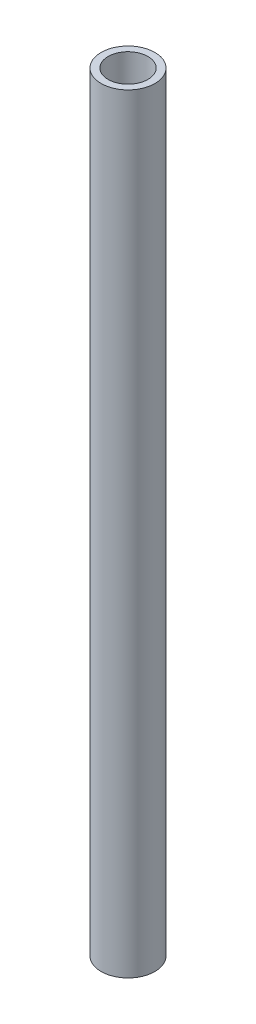
ISO-10303-21;
HEADER;
FILE_DESCRIPTION(('STEP AP214'),'2;1');
FILE_NAME('part.step','',(''),(''),'','','');
FILE_SCHEMA(('AUTOMOTIVE_DESIGN { 1 0 10303 214 1 1 1 1 }'));
ENDSEC;
DATA;
#1=APPLICATION_CONTEXT('core data for automotive mechanical design processes');
#2=APPLICATION_PROTOCOL_DEFINITION('international standard','automotive_design',2000,#1);
#3=PRODUCT_CONTEXT('',#1,'mechanical');
#4=PRODUCT('Part','Part','',(#3));
#5=PRODUCT_RELATED_PRODUCT_CATEGORY('part','',(#4));
#6=PRODUCT_DEFINITION_FORMATION('','',#4);
#7=PRODUCT_DEFINITION_CONTEXT('part definition',#1,'design');
#8=PRODUCT_DEFINITION('design','',#6,#7);
#9=PRODUCT_DEFINITION_SHAPE('','',#8);
#10=(LENGTH_UNIT() NAMED_UNIT(*) SI_UNIT(.MILLI.,.METRE.));
#11=(NAMED_UNIT(*) PLANE_ANGLE_UNIT() SI_UNIT($,.RADIAN.));
#12=(NAMED_UNIT(*) SI_UNIT($,.STERADIAN.) SOLID_ANGLE_UNIT());
#13=UNCERTAINTY_MEASURE_WITH_UNIT(LENGTH_MEASURE(1.E-05),#10,'distance_accuracy_value','');
#14=(GEOMETRIC_REPRESENTATION_CONTEXT(3) GLOBAL_UNCERTAINTY_ASSIGNED_CONTEXT((#13)) GLOBAL_UNIT_ASSIGNED_CONTEXT((#10,
#11,#12)) REPRESENTATION_CONTEXT('',''));
#15=CARTESIAN_POINT('',(0.,0.,0.));
#16=DIRECTION('',(0.,0.,1.));
#17=DIRECTION('',(1.,0.,0.));
#18=AXIS2_PLACEMENT_3D('',#15,#16,#17);
#19=CARTESIAN_POINT('',(0.,304.8,0.));
#20=DIRECTION('',(0.,1.,0.));
#21=DIRECTION('',(0.,0.,1.));
#22=AXIS2_PLACEMENT_3D('',#19,#20,#21);
#23=PLANE('',#22);
#24=CARTESIAN_POINT('',(0.,304.8,0.));
#25=DIRECTION('',(0.,1.,0.));
#26=DIRECTION('',(0.,0.,1.));
#27=AXIS2_PLACEMENT_3D('',#24,#25,#26);
#28=CIRCLE('',#27,10.668);
#29=CARTESIAN_POINT('',(0.,304.8,-10.668));
#30=VERTEX_POINT('',#29);
#31=EDGE_CURVE('E10',#30,#30,#28,.T.);
#32=ORIENTED_EDGE('',*,*,#31,.T.);
#33=EDGE_LOOP('',(#32));
#34=FACE_BOUND('',#33,.T.);
#35=CARTESIAN_POINT('',(0.,304.8,0.));
#36=DIRECTION('',(0.,1.,0.));
#37=DIRECTION('',(0.,0.,1.));
#38=AXIS2_PLACEMENT_3D('',#35,#36,#37);
#39=CIRCLE('',#38,7.8994);
#40=CARTESIAN_POINT('',(0.,304.8,-7.8994));
#41=VERTEX_POINT('',#40);
#42=EDGE_CURVE('E50',#41,#41,#39,.T.);
#43=ORIENTED_EDGE('',*,*,#42,.F.);
#44=EDGE_LOOP('',(#43));
#45=FACE_BOUND('',#44,.T.);
#46=ADVANCED_FACE('F37',(#34,#45),#23,.T.);
#47=CARTESIAN_POINT('',(0.,0.,0.));
#48=DIRECTION('',(0.,1.,0.));
#49=DIRECTION('',(0.,0.,1.));
#50=AXIS2_PLACEMENT_3D('',#47,#48,#49);
#51=PLANE('',#50);
#52=CARTESIAN_POINT('',(0.,0.,0.));
#53=DIRECTION('',(0.,1.,0.));
#54=DIRECTION('',(0.,0.,1.));
#55=AXIS2_PLACEMENT_3D('',#52,#53,#54);
#56=CIRCLE('',#55,10.668);
#57=CARTESIAN_POINT('',(0.,0.,-10.668));
#58=VERTEX_POINT('',#57);
#59=EDGE_CURVE('E41',#58,#58,#56,.T.);
#60=ORIENTED_EDGE('',*,*,#59,.F.);
#61=EDGE_LOOP('',(#60));
#62=FACE_BOUND('',#61,.T.);
#63=CARTESIAN_POINT('',(0.,0.,0.));
#64=DIRECTION('',(0.,1.,0.));
#65=DIRECTION('',(0.,0.,1.));
#66=AXIS2_PLACEMENT_3D('',#63,#64,#65);
#67=CIRCLE('',#66,7.8994);
#68=CARTESIAN_POINT('',(0.,0.,-7.8994));
#69=VERTEX_POINT('',#68);
#70=EDGE_CURVE('E52',#69,#69,#67,.T.);
#71=ORIENTED_EDGE('',*,*,#70,.T.);
#72=EDGE_LOOP('',(#71));
#73=FACE_BOUND('',#72,.T.);
#74=ADVANCED_FACE('F64',(#62,#73),#51,.F.);
#75=CARTESIAN_POINT('',(0.,304.8,0.));
#76=DIRECTION('',(0.,-1.,0.));
#77=DIRECTION('',(0.,0.,-1.));
#78=AXIS2_PLACEMENT_3D('',#75,#76,#77);
#79=CYLINDRICAL_SURFACE('',#78,10.668);
#80=CARTESIAN_POINT('',(0.,304.8,-10.668));
#81=CARTESIAN_POINT('',(0.,301.625,-10.668));
#82=CARTESIAN_POINT('',(0.,298.45,-10.668));
#83=CARTESIAN_POINT('',(0.,292.1,-10.668));
#84=CARTESIAN_POINT('',(0.,288.925,-10.668));
#85=CARTESIAN_POINT('',(0.,282.575,-10.668));
#86=CARTESIAN_POINT('',(0.,279.4,-10.668));
#87=CARTESIAN_POINT('',(0.,273.05,-10.668));
#88=CARTESIAN_POINT('',(0.,269.875,-10.668));
#89=CARTESIAN_POINT('',(0.,263.525,-10.668));
#90=CARTESIAN_POINT('',(0.,260.35,-10.668));
#91=CARTESIAN_POINT('',(0.,254.,-10.668));
#92=CARTESIAN_POINT('',(0.,250.825,-10.668));
#93=CARTESIAN_POINT('',(0.,244.475,-10.668));
#94=CARTESIAN_POINT('',(0.,241.3,-10.668));
#95=CARTESIAN_POINT('',(0.,234.95,-10.668));
#96=CARTESIAN_POINT('',(0.,231.775,-10.668));
#97=CARTESIAN_POINT('',(0.,225.425,-10.668));
#98=CARTESIAN_POINT('',(0.,222.25,-10.668));
#99=CARTESIAN_POINT('',(0.,215.9,-10.668));
#100=CARTESIAN_POINT('',(0.,212.725,-10.668));
#101=CARTESIAN_POINT('',(0.,206.375,-10.668));
#102=CARTESIAN_POINT('',(0.,203.2,-10.668));
#103=CARTESIAN_POINT('',(0.,196.85,-10.668));
#104=CARTESIAN_POINT('',(0.,193.675,-10.668));
#105=CARTESIAN_POINT('',(0.,187.325,-10.668));
#106=CARTESIAN_POINT('',(0.,184.15,-10.668));
#107=CARTESIAN_POINT('',(0.,177.8,-10.668));
#108=CARTESIAN_POINT('',(0.,174.625,-10.668));
#109=CARTESIAN_POINT('',(0.,168.275,-10.668));
#110=CARTESIAN_POINT('',(0.,165.1,-10.668));
#111=CARTESIAN_POINT('',(0.,158.75,-10.668));
#112=CARTESIAN_POINT('',(0.,155.575,-10.668));
#113=CARTESIAN_POINT('',(0.,149.225,-10.668));
#114=CARTESIAN_POINT('',(0.,146.05,-10.668));
#115=CARTESIAN_POINT('',(0.,139.7,-10.668));
#116=CARTESIAN_POINT('',(0.,136.525,-10.668));
#117=CARTESIAN_POINT('',(0.,130.175,-10.668));
#118=CARTESIAN_POINT('',(0.,127.,-10.668));
#119=CARTESIAN_POINT('',(0.,120.65,-10.668));
#120=CARTESIAN_POINT('',(0.,117.475,-10.668));
#121=CARTESIAN_POINT('',(0.,111.125,-10.668));
#122=CARTESIAN_POINT('',(0.,107.95,-10.668));
#123=CARTESIAN_POINT('',(0.,101.6,-10.668));
#124=CARTESIAN_POINT('',(0.,98.425,-10.668));
#125=CARTESIAN_POINT('',(0.,92.075,-10.668));
#126=CARTESIAN_POINT('',(0.,88.9,-10.668));
#127=CARTESIAN_POINT('',(0.,82.55,-10.668));
#128=CARTESIAN_POINT('',(0.,79.375,-10.668));
#129=CARTESIAN_POINT('',(0.,73.025,-10.668));
#130=CARTESIAN_POINT('',(0.,69.85,-10.668));
#131=CARTESIAN_POINT('',(0.,63.5,-10.668));
#132=CARTESIAN_POINT('',(0.,60.325,-10.668));
#133=CARTESIAN_POINT('',(0.,53.975,-10.668));
#134=CARTESIAN_POINT('',(0.,50.8,-10.668));
#135=CARTESIAN_POINT('',(0.,44.45,-10.668));
#136=CARTESIAN_POINT('',(0.,41.275,-10.668));
#137=CARTESIAN_POINT('',(0.,34.925,-10.668));
#138=CARTESIAN_POINT('',(0.,31.75,-10.668));
#139=CARTESIAN_POINT('',(0.,25.4,-10.668));
#140=CARTESIAN_POINT('',(0.,22.225,-10.668));
#141=CARTESIAN_POINT('',(0.,15.875,-10.668));
#142=CARTESIAN_POINT('',(0.,12.7,-10.668));
#143=CARTESIAN_POINT('',(0.,6.35,-10.668));
#144=CARTESIAN_POINT('',(0.,3.175,-10.668));
#145=CARTESIAN_POINT('',(0.,0.,-10.668));
#146=B_SPLINE_CURVE_WITH_KNOTS('',3,(#80,#81,#82,#83,#84,#85,#86,#87,#88,#89,#90,#91,#92,#93,
#94,#95,#96,#97,#98,#99,#100,#101,#102,#103,#104,#105,#106,#107,#108,#109,#110,#111,#112,#113,
#114,#115,#116,#117,#118,#119,#120,#121,#122,#123,#124,#125,#126,#127,#128,#129,#130,#131,#132,
#133,#134,#135,#136,#137,#138,#139,#140,#141,#142,#143,#144,#145),.UNSPECIFIED.,.F.,.F.,(4,2,2,
2,2,2,2,2,2,2,2,2,2,2,2,2,2,2,2,2,2,2,2,2,2,2,2,2,2,2,2,2,4),(0.,9.52500000000001,19.05,28.575,
38.1,47.625,57.15,66.675,76.2,85.7250000000001,95.2500000000001,104.775,114.3,123.825,133.35,
142.875,152.4,161.925,171.45,180.975,190.5,200.025,209.55,219.075,228.6,238.125,247.65,257.175,
266.7,276.225,285.75,295.275,304.8),.UNSPECIFIED.);
#147=EDGE_CURVE('BSEAM39',#30,#58,#146,.T.);
#148=ORIENTED_EDGE('',*,*,#31,.F.);
#149=ORIENTED_EDGE('',*,*,#59,.T.);
#150=ORIENTED_EDGE('',*,*,#147,.T.);
#151=ORIENTED_EDGE('',*,*,#147,.F.);
#152=EDGE_LOOP('',(#148,#150,#149,#151));
#153=FACE_BOUND('',#152,.T.);
#154=ADVANCED_FACE('F39',(#153),#79,.T.);
#155=CARTESIAN_POINT('',(0.,304.8,0.));
#156=DIRECTION('',(0.,-1.,0.));
#157=DIRECTION('',(0.,0.,-1.));
#158=AXIS2_PLACEMENT_3D('',#155,#156,#157);
#159=CYLINDRICAL_SURFACE('',#158,7.8994);
#160=CARTESIAN_POINT('',(0.,304.8,-7.8994));
#161=CARTESIAN_POINT('',(0.,301.625,-7.8994));
#162=CARTESIAN_POINT('',(0.,298.45,-7.8994));
#163=CARTESIAN_POINT('',(0.,292.1,-7.8994));
#164=CARTESIAN_POINT('',(0.,288.925,-7.8994));
#165=CARTESIAN_POINT('',(0.,282.575,-7.8994));
#166=CARTESIAN_POINT('',(0.,279.4,-7.8994));
#167=CARTESIAN_POINT('',(0.,273.05,-7.8994));
#168=CARTESIAN_POINT('',(0.,269.875,-7.8994));
#169=CARTESIAN_POINT('',(0.,263.525,-7.8994));
#170=CARTESIAN_POINT('',(0.,260.35,-7.8994));
#171=CARTESIAN_POINT('',(0.,254.,-7.8994));
#172=CARTESIAN_POINT('',(0.,250.825,-7.8994));
#173=CARTESIAN_POINT('',(0.,244.475,-7.8994));
#174=CARTESIAN_POINT('',(0.,241.3,-7.8994));
#175=CARTESIAN_POINT('',(0.,234.95,-7.8994));
#176=CARTESIAN_POINT('',(0.,231.775,-7.8994));
#177=CARTESIAN_POINT('',(0.,225.425,-7.8994));
#178=CARTESIAN_POINT('',(0.,222.25,-7.8994));
#179=CARTESIAN_POINT('',(0.,215.9,-7.8994));
#180=CARTESIAN_POINT('',(0.,212.725,-7.8994));
#181=CARTESIAN_POINT('',(0.,206.375,-7.8994));
#182=CARTESIAN_POINT('',(0.,203.2,-7.8994));
#183=CARTESIAN_POINT('',(0.,196.85,-7.8994));
#184=CARTESIAN_POINT('',(0.,193.675,-7.8994));
#185=CARTESIAN_POINT('',(0.,187.325,-7.8994));
#186=CARTESIAN_POINT('',(0.,184.15,-7.8994));
#187=CARTESIAN_POINT('',(0.,177.8,-7.8994));
#188=CARTESIAN_POINT('',(0.,174.625,-7.8994));
#189=CARTESIAN_POINT('',(0.,168.275,-7.8994));
#190=CARTESIAN_POINT('',(0.,165.1,-7.8994));
#191=CARTESIAN_POINT('',(0.,158.75,-7.8994));
#192=CARTESIAN_POINT('',(0.,155.575,-7.8994));
#193=CARTESIAN_POINT('',(0.,149.225,-7.8994));
#194=CARTESIAN_POINT('',(0.,146.05,-7.8994));
#195=CARTESIAN_POINT('',(0.,139.7,-7.8994));
#196=CARTESIAN_POINT('',(0.,136.525,-7.8994));
#197=CARTESIAN_POINT('',(0.,130.175,-7.8994));
#198=CARTESIAN_POINT('',(0.,127.,-7.8994));
#199=CARTESIAN_POINT('',(0.,120.65,-7.8994));
#200=CARTESIAN_POINT('',(0.,117.475,-7.8994));
#201=CARTESIAN_POINT('',(0.,111.125,-7.8994));
#202=CARTESIAN_POINT('',(0.,107.95,-7.8994));
#203=CARTESIAN_POINT('',(0.,101.6,-7.8994));
#204=CARTESIAN_POINT('',(0.,98.425,-7.8994));
#205=CARTESIAN_POINT('',(0.,92.075,-7.8994));
#206=CARTESIAN_POINT('',(0.,88.9,-7.8994));
#207=CARTESIAN_POINT('',(0.,82.55,-7.8994));
#208=CARTESIAN_POINT('',(0.,79.375,-7.8994));
#209=CARTESIAN_POINT('',(0.,73.025,-7.8994));
#210=CARTESIAN_POINT('',(0.,69.85,-7.8994));
#211=CARTESIAN_POINT('',(0.,63.5,-7.8994));
#212=CARTESIAN_POINT('',(0.,60.325,-7.8994));
#213=CARTESIAN_POINT('',(0.,53.975,-7.8994));
#214=CARTESIAN_POINT('',(0.,50.8,-7.8994));
#215=CARTESIAN_POINT('',(0.,44.45,-7.8994));
#216=CARTESIAN_POINT('',(0.,41.275,-7.8994));
#217=CARTESIAN_POINT('',(0.,34.925,-7.8994));
#218=CARTESIAN_POINT('',(0.,31.75,-7.8994));
#219=CARTESIAN_POINT('',(0.,25.4,-7.8994));
#220=CARTESIAN_POINT('',(0.,22.225,-7.8994));
#221=CARTESIAN_POINT('',(0.,15.875,-7.8994));
#222=CARTESIAN_POINT('',(0.,12.7,-7.8994));
#223=CARTESIAN_POINT('',(0.,6.35,-7.8994));
#224=CARTESIAN_POINT('',(0.,3.175,-7.8994));
#225=CARTESIAN_POINT('',(0.,0.,-7.8994));
#226=B_SPLINE_CURVE_WITH_KNOTS('',3,(#160,#161,#162,#163,#164,#165,#166,#167,#168,#169,#170,
#171,#172,#173,#174,#175,#176,#177,#178,#179,#180,#181,#182,#183,#184,#185,#186,#187,#188,#189,
#190,#191,#192,#193,#194,#195,#196,#197,#198,#199,#200,#201,#202,#203,#204,#205,#206,#207,#208,
#209,#210,#211,#212,#213,#214,#215,#216,#217,#218,#219,#220,#221,#222,#223,#224,#225),
.UNSPECIFIED.,.F.,.F.,(4,2,2,2,2,2,2,2,2,2,2,2,2,2,2,2,2,2,2,2,2,2,2,2,2,2,2,2,2,2,2,2,4),(0.,
9.52500000000001,19.05,28.575,38.1,47.625,57.15,66.675,76.2,85.7250000000001,95.2500000000001,
104.775,114.3,123.825,133.35,142.875,152.4,161.925,171.45,180.975,190.5,200.025,209.55,219.075,
228.6,238.125,247.65,257.175,266.7,276.225,285.75,295.275,304.8),.UNSPECIFIED.);
#227=EDGE_CURVE('BSEAM60',#41,#69,#226,.T.);
#228=ORIENTED_EDGE('',*,*,#42,.T.);
#229=ORIENTED_EDGE('',*,*,#70,.F.);
#230=ORIENTED_EDGE('',*,*,#227,.T.);
#231=ORIENTED_EDGE('',*,*,#227,.F.);
#232=EDGE_LOOP('',(#228,#230,#229,#231));
#233=FACE_BOUND('',#232,.T.);
#234=ADVANCED_FACE('F60',(#233),#159,.F.);
#235=CLOSED_SHELL('',(#46,#74,#154,#234));
#236=MANIFOLD_SOLID_BREP('B2',#235);
#237=ADVANCED_BREP_SHAPE_REPRESENTATION('',(#18,#236),#14);
#238=SHAPE_DEFINITION_REPRESENTATION(#9,#237);
ENDSEC;
END-ISO-10303-21;
